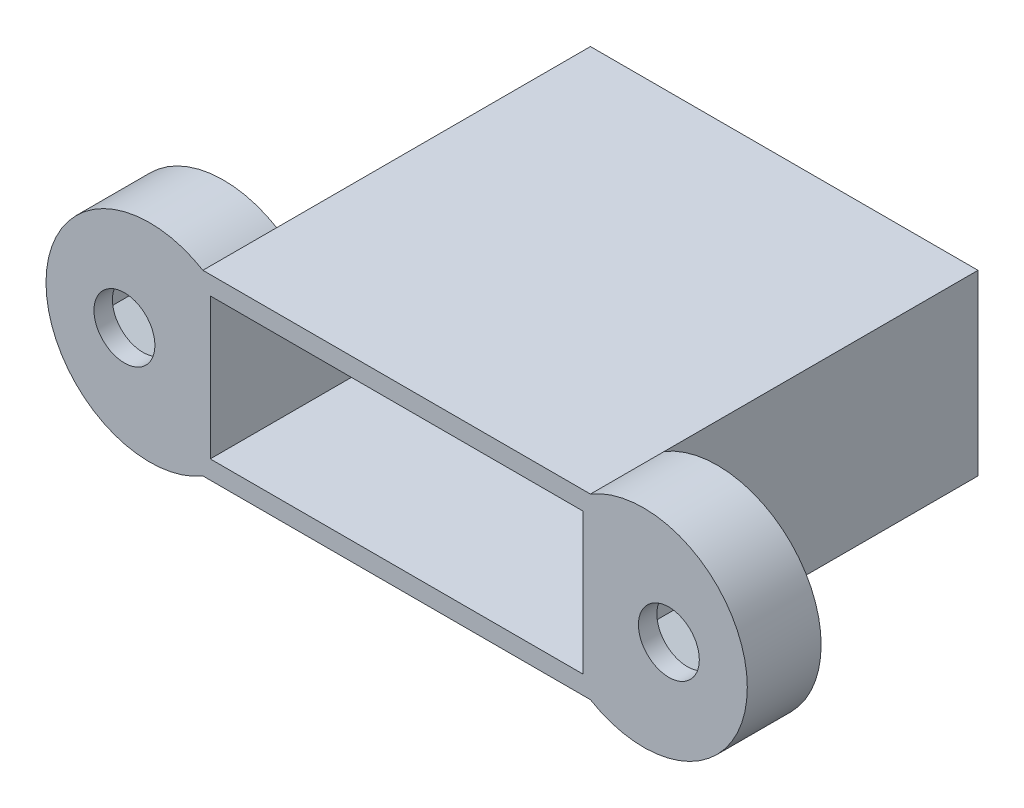
ISO-10303-21;
HEADER;
FILE_DESCRIPTION(('STEP AP214'),'2;1');
FILE_NAME('part.step','',(''),(''),'','','');
FILE_SCHEMA(('AUTOMOTIVE_DESIGN { 1 0 10303 214 1 1 1 1 }'));
ENDSEC;
DATA;
#1=APPLICATION_CONTEXT('core data for automotive mechanical design processes');
#2=APPLICATION_PROTOCOL_DEFINITION('international standard','automotive_design',2000,#1);
#3=PRODUCT_CONTEXT('',#1,'mechanical');
#4=PRODUCT('Part','Part','',(#3));
#5=PRODUCT_RELATED_PRODUCT_CATEGORY('part','',(#4));
#6=PRODUCT_DEFINITION_FORMATION('','',#4);
#7=PRODUCT_DEFINITION_CONTEXT('part definition',#1,'design');
#8=PRODUCT_DEFINITION('design','',#6,#7);
#9=PRODUCT_DEFINITION_SHAPE('','',#8);
#10=(LENGTH_UNIT() NAMED_UNIT(*) SI_UNIT(.MILLI.,.METRE.));
#11=(NAMED_UNIT(*) PLANE_ANGLE_UNIT() SI_UNIT($,.RADIAN.));
#12=(NAMED_UNIT(*) SI_UNIT($,.STERADIAN.) SOLID_ANGLE_UNIT());
#13=UNCERTAINTY_MEASURE_WITH_UNIT(LENGTH_MEASURE(1.E-05),#10,'distance_accuracy_value','');
#14=(GEOMETRIC_REPRESENTATION_CONTEXT(3) GLOBAL_UNCERTAINTY_ASSIGNED_CONTEXT((#13)) GLOBAL_UNIT_ASSIGNED_CONTEXT((#10,
#11,#12)) REPRESENTATION_CONTEXT('',''));
#15=CARTESIAN_POINT('',(0.,0.,0.));
#16=DIRECTION('',(0.,0.,1.));
#17=DIRECTION('',(1.,0.,0.));
#18=AXIS2_PLACEMENT_3D('',#15,#16,#17);
#19=CARTESIAN_POINT('',(-10.0783878504673,4.92646028037383,21.));
#20=DIRECTION('',(1.,0.,0.));
#21=DIRECTION('',(0.,0.,-1.));
#22=AXIS2_PLACEMENT_3D('',#19,#20,#21);
#23=PLANE('',#22);
#24=DIRECTION('',(0.,-1.,0.));
#25=VECTOR('',#24,1.);
#26=CARTESIAN_POINT('',(-10.0783878504673,4.92646028037383,17.));
#27=LINE('',#26,#25);
#28=CARTESIAN_POINT('',(-10.0783878504673,4.92646028037383,17.));
#29=VERTEX_POINT('',#28);
#30=CARTESIAN_POINT('',(-10.0783878504673,-4.72353971962617,17.));
#31=VERTEX_POINT('',#30);
#32=EDGE_CURVE('E368',#29,#31,#27,.T.);
#33=ORIENTED_EDGE('',*,*,#32,.F.);
#34=DIRECTION('',(0.,0.,-1.));
#35=VECTOR('',#34,1.);
#36=CARTESIAN_POINT('',(-10.0783878504673,4.92646028037383,21.));
#37=LINE('',#36,#35);
#38=CARTESIAN_POINT('',(-10.0783878504673,4.92646028037383,0.));
#39=VERTEX_POINT('',#38);
#40=EDGE_CURVE('E456',#29,#39,#37,.T.);
#41=ORIENTED_EDGE('',*,*,#40,.T.);
#42=DIRECTION('',(0.,-1.,0.));
#43=VECTOR('',#42,1.);
#44=CARTESIAN_POINT('',(-10.0783878504673,4.92646028037383,0.));
#45=LINE('',#44,#43);
#46=CARTESIAN_POINT('',(-10.0783878504673,-4.72353971962617,0.));
#47=VERTEX_POINT('',#46);
#48=EDGE_CURVE('E437',#39,#47,#45,.T.);
#49=ORIENTED_EDGE('',*,*,#48,.T.);
#50=DIRECTION('',(0.,0.,-1.));
#51=VECTOR('',#50,1.);
#52=CARTESIAN_POINT('',(-10.0783878504673,-4.72353971962617,21.));
#53=LINE('',#52,#51);
#54=EDGE_CURVE('E483',#31,#47,#53,.T.);
#55=ORIENTED_EDGE('',*,*,#54,.F.);
#56=EDGE_LOOP('',(#33,#41,#49,#55));
#57=FACE_BOUND('',#56,.T.);
#58=ADVANCED_FACE('F39',(#57),#23,.F.);
#59=CARTESIAN_POINT('',(-10.0783878504673,-4.72353971962617,21.));
#60=DIRECTION('',(0.,1.,0.));
#61=DIRECTION('',(0.,0.,1.));
#62=AXIS2_PLACEMENT_3D('',#59,#60,#61);
#63=PLANE('',#62);
#64=DIRECTION('',(1.,0.,0.));
#65=VECTOR('',#64,1.);
#66=CARTESIAN_POINT('',(-10.0783878504673,-4.72353971962617,0.));
#67=LINE('',#66,#65);
#68=CARTESIAN_POINT('',(10.9216121495327,-4.72353971962617,0.));
#69=VERTEX_POINT('',#68);
#70=EDGE_CURVE('E460',#47,#69,#67,.T.);
#71=ORIENTED_EDGE('',*,*,#70,.T.);
#72=DIRECTION('',(0.,0.,-1.));
#73=VECTOR('',#72,1.);
#74=CARTESIAN_POINT('',(10.9216121495327,-4.72353971962617,21.));
#75=LINE('',#74,#73);
#76=CARTESIAN_POINT('',(10.9216121495327,-4.72353971962617,17.));
#77=VERTEX_POINT('',#76);
#78=EDGE_CURVE('E479',#77,#69,#75,.T.);
#79=ORIENTED_EDGE('',*,*,#78,.F.);
#80=CARTESIAN_POINT('',(10.9216121495327,-4.72353971962617,21.));
#81=VERTEX_POINT('',#80);
#82=EDGE_CURVE('E480',#81,#77,#75,.T.);
#83=ORIENTED_EDGE('',*,*,#82,.F.);
#84=DIRECTION('',(1.,0.,0.));
#85=VECTOR('',#84,1.);
#86=CARTESIAN_POINT('',(-10.0783878504673,-4.72353971962617,21.));
#87=LINE('',#86,#85);
#88=CARTESIAN_POINT('',(-10.0783878504673,-4.72353971962617,21.));
#89=VERTEX_POINT('',#88);
#90=EDGE_CURVE('E447',#89,#81,#87,.T.);
#91=ORIENTED_EDGE('',*,*,#90,.F.);
#92=EDGE_CURVE('E484',#89,#31,#53,.T.);
#93=ORIENTED_EDGE('',*,*,#92,.T.);
#94=ORIENTED_EDGE('',*,*,#54,.T.);
#95=EDGE_LOOP('',(#71,#79,#83,#91,#93,#94));
#96=FACE_BOUND('',#95,.T.);
#97=ADVANCED_FACE('F535',(#96),#63,.F.);
#98=CARTESIAN_POINT('',(10.9216121495327,4.92646028037383,21.));
#99=DIRECTION('',(-1.,0.,0.));
#100=DIRECTION('',(0.,-1.,0.));
#101=AXIS2_PLACEMENT_3D('',#98,#99,#100);
#102=PLANE('',#101);
#103=DIRECTION('',(0.,0.,-1.));
#104=VECTOR('',#103,1.);
#105=CARTESIAN_POINT('',(10.9216121495327,4.92646028037383,21.));
#106=LINE('',#105,#104);
#107=CARTESIAN_POINT('',(10.9216121495327,4.92646028037383,17.));
#108=VERTEX_POINT('',#107);
#109=CARTESIAN_POINT('',(10.9216121495327,4.92646028037383,0.));
#110=VERTEX_POINT('',#109);
#111=EDGE_CURVE('E474',#108,#110,#106,.T.);
#112=ORIENTED_EDGE('',*,*,#111,.F.);
#113=DIRECTION('',(0.,-1.,0.));
#114=VECTOR('',#113,1.);
#115=CARTESIAN_POINT('',(10.9216121495327,4.92646028037383,17.));
#116=LINE('',#115,#114);
#117=EDGE_CURVE('E292',#108,#77,#116,.T.);
#118=ORIENTED_EDGE('',*,*,#117,.T.);
#119=ORIENTED_EDGE('',*,*,#78,.T.);
#120=DIRECTION('',(0.,1.,0.));
#121=VECTOR('',#120,1.);
#122=CARTESIAN_POINT('',(10.9216121495327,4.92646028037383,0.));
#123=LINE('',#122,#121);
#124=EDGE_CURVE('E464',#69,#110,#123,.T.);
#125=ORIENTED_EDGE('',*,*,#124,.T.);
#126=EDGE_LOOP('',(#112,#118,#119,#125));
#127=FACE_BOUND('',#126,.T.);
#128=ADVANCED_FACE('F546',(#127),#102,.F.);
#129=CARTESIAN_POINT('',(-10.0783878504673,4.92646028037383,21.));
#130=DIRECTION('',(0.,-1.,0.));
#131=DIRECTION('',(0.,0.,-1.));
#132=AXIS2_PLACEMENT_3D('',#129,#130,#131);
#133=PLANE('',#132);
#134=DIRECTION('',(-1.,0.,0.));
#135=VECTOR('',#134,1.);
#136=CARTESIAN_POINT('',(-10.0783878504673,4.92646028037383,0.));
#137=LINE('',#136,#135);
#138=EDGE_CURVE('E452',#110,#39,#137,.T.);
#139=ORIENTED_EDGE('',*,*,#138,.T.);
#140=ORIENTED_EDGE('',*,*,#40,.F.);
#141=CARTESIAN_POINT('',(-10.0783878504673,4.92646028037383,21.));
#142=VERTEX_POINT('',#141);
#143=EDGE_CURVE('E471',#142,#29,#37,.T.);
#144=ORIENTED_EDGE('',*,*,#143,.F.);
#145=DIRECTION('',(-1.,0.,0.));
#146=VECTOR('',#145,1.);
#147=CARTESIAN_POINT('',(-10.0783878504673,4.92646028037383,21.));
#148=LINE('',#147,#146);
#149=CARTESIAN_POINT('',(10.9216121495327,4.92646028037383,21.));
#150=VERTEX_POINT('',#149);
#151=EDGE_CURVE('E451',#150,#142,#148,.T.);
#152=ORIENTED_EDGE('',*,*,#151,.F.);
#153=EDGE_CURVE('E475',#150,#108,#106,.T.);
#154=ORIENTED_EDGE('',*,*,#153,.T.);
#155=ORIENTED_EDGE('',*,*,#111,.T.);
#156=EDGE_LOOP('',(#139,#140,#144,#152,#154,#155));
#157=FACE_BOUND('',#156,.T.);
#158=ADVANCED_FACE('F509',(#157),#133,.F.);
#159=CARTESIAN_POINT('',(0.,0.,21.));
#160=DIRECTION('',(0.,0.,1.));
#161=DIRECTION('',(1.,0.,0.));
#162=AXIS2_PLACEMENT_3D('',#159,#160,#161);
#163=PLANE('',#162);
#164=CARTESIAN_POINT('',(15.1716121495327,0.101460280373835,21.));
#165=DIRECTION('',(0.,0.,1.));
#166=DIRECTION('',(1.,0.,0.));
#167=AXIS2_PLACEMENT_3D('',#164,#165,#166);
#168=CIRCLE('',#167,1.65);
#169=CARTESIAN_POINT('',(16.8216121495327,0.101460280373835,21.));
#170=VERTEX_POINT('',#169);
#171=EDGE_CURVE('E42',#170,#170,#168,.T.);
#172=ORIENTED_EDGE('',*,*,#171,.F.);
#173=EDGE_LOOP('',(#172));
#174=FACE_BOUND('',#173,.T.);
#175=CARTESIAN_POINT('',(-14.3283878504673,0.101460280373833,21.));
#176=DIRECTION('',(0.,0.,1.));
#177=DIRECTION('',(1.,0.,0.));
#178=AXIS2_PLACEMENT_3D('',#175,#176,#177);
#179=CIRCLE('',#178,1.65);
#180=CARTESIAN_POINT('',(-12.6783878504673,0.101460280373833,21.));
#181=VERTEX_POINT('',#180);
#182=EDGE_CURVE('E302',#181,#181,#179,.T.);
#183=ORIENTED_EDGE('',*,*,#182,.F.);
#184=EDGE_LOOP('',(#183));
#185=FACE_BOUND('',#184,.T.);
#186=DIRECTION('',(0.,-1.,0.));
#187=VECTOR('',#186,1.);
#188=CARTESIAN_POINT('',(-9.67838785046729,3.92646028037383,21.));
#189=LINE('',#188,#187);
#190=CARTESIAN_POINT('',(-9.67838785046729,3.92646028037383,21.));
#191=VERTEX_POINT('',#190);
#192=CARTESIAN_POINT('',(-9.67838785046729,-3.72353971962617,21.));
#193=VERTEX_POINT('',#192);
#194=EDGE_CURVE('E392',#191,#193,#189,.T.);
#195=ORIENTED_EDGE('',*,*,#194,.F.);
#196=DIRECTION('',(-1.,0.,0.));
#197=VECTOR('',#196,1.);
#198=CARTESIAN_POINT('',(-9.67838785046729,3.92646028037383,21.));
#199=LINE('',#198,#197);
#200=CARTESIAN_POINT('',(10.5216121495327,3.92646028037383,21.));
#201=VERTEX_POINT('',#200);
#202=EDGE_CURVE('E407',#201,#191,#199,.T.);
#203=ORIENTED_EDGE('',*,*,#202,.F.);
#204=DIRECTION('',(0.,1.,0.));
#205=VECTOR('',#204,1.);
#206=CARTESIAN_POINT('',(10.5216121495327,3.92646028037383,21.));
#207=LINE('',#206,#205);
#208=CARTESIAN_POINT('',(10.5216121495327,-3.72353971962617,21.));
#209=VERTEX_POINT('',#208);
#210=EDGE_CURVE('E427',#209,#201,#207,.T.);
#211=ORIENTED_EDGE('',*,*,#210,.F.);
#212=DIRECTION('',(1.,0.,0.));
#213=VECTOR('',#212,1.);
#214=CARTESIAN_POINT('',(-9.67838785046729,-3.72353971962617,21.));
#215=LINE('',#214,#213);
#216=EDGE_CURVE('E423',#193,#209,#215,.T.);
#217=ORIENTED_EDGE('',*,*,#216,.F.);
#218=EDGE_LOOP('',(#195,#203,#211,#217));
#219=FACE_BOUND('',#218,.T.);
#220=ORIENTED_EDGE('',*,*,#151,.T.);
#221=CARTESIAN_POINT('',(-12.9589393210555,0.101460280373833,21.));
#222=DIRECTION('',(0.,0.,1.));
#223=DIRECTION('',(1.,0.,0.));
#224=AXIS2_PLACEMENT_3D('',#221,#222,#223);
#225=CIRCLE('',#224,5.61944852941176);
#226=EDGE_CURVE('E353',#142,#89,#225,.T.);
#227=ORIENTED_EDGE('',*,*,#226,.T.);
#228=ORIENTED_EDGE('',*,*,#90,.T.);
#229=CARTESIAN_POINT('',(13.8021636201209,0.101460280373833,21.));
#230=DIRECTION('',(0.,0.,1.));
#231=DIRECTION('',(-1.,0.,0.));
#232=AXIS2_PLACEMENT_3D('',#229,#230,#231);
#233=CIRCLE('',#232,5.61944852941177);
#234=EDGE_CURVE('E277',#81,#150,#233,.T.);
#235=ORIENTED_EDGE('',*,*,#234,.T.);
#236=EDGE_LOOP('',(#220,#227,#228,#235));
#237=FACE_BOUND('',#236,.T.);
#238=ADVANCED_FACE('F505',(#174,#185,#219,#237),#163,.T.);
#239=CARTESIAN_POINT('',(0.,0.,0.));
#240=DIRECTION('',(0.,0.,1.));
#241=DIRECTION('',(1.,0.,0.));
#242=AXIS2_PLACEMENT_3D('',#239,#240,#241);
#243=PLANE('',#242);
#244=DIRECTION('',(-1.,0.,0.));
#245=VECTOR('',#244,1.);
#246=CARTESIAN_POINT('',(0.,3.92646028037383,0.));
#247=LINE('',#246,#245);
#248=CARTESIAN_POINT('',(1.67161214953271,3.92646028037383,0.));
#249=VERTEX_POINT('',#248);
#250=CARTESIAN_POINT('',(-0.828387850467288,3.92646028037383,0.));
#251=VERTEX_POINT('',#250);
#252=EDGE_CURVE('E48',#249,#251,#247,.T.);
#253=ORIENTED_EDGE('',*,*,#252,.T.);
#254=CARTESIAN_POINT('',(-0.828387850467288,1.92646028037383,0.));
#255=DIRECTION('',(0.,0.,1.));
#256=DIRECTION('',(1.,0.,0.));
#257=AXIS2_PLACEMENT_3D('',#254,#255,#256);
#258=CIRCLE('',#257,2.);
#259=CARTESIAN_POINT('',(-0.828387850467288,-0.0735397196261661,0.));
#260=VERTEX_POINT('',#259);
#261=EDGE_CURVE('E11',#251,#260,#258,.T.);
#262=ORIENTED_EDGE('',*,*,#261,.T.);
#263=DIRECTION('',(1.,0.,0.));
#264=VECTOR('',#263,1.);
#265=CARTESIAN_POINT('',(0.,-0.0735397196261661,0.));
#266=LINE('',#265,#264);
#267=CARTESIAN_POINT('',(1.67161214953271,-0.073539719626166,0.));
#268=VERTEX_POINT('',#267);
#269=EDGE_CURVE('E488',#260,#268,#266,.T.);
#270=ORIENTED_EDGE('',*,*,#269,.T.);
#271=CARTESIAN_POINT('',(1.67161214953271,1.92646028037383,0.));
#272=DIRECTION('',(0.,0.,1.));
#273=DIRECTION('',(1.,0.,0.));
#274=AXIS2_PLACEMENT_3D('',#271,#272,#273);
#275=CIRCLE('',#274,2.);
#276=EDGE_CURVE('E492',#268,#249,#275,.T.);
#277=ORIENTED_EDGE('',*,*,#276,.T.);
#278=EDGE_LOOP('',(#253,#262,#270,#277));
#279=FACE_BOUND('',#278,.T.);
#280=ORIENTED_EDGE('',*,*,#48,.F.);
#281=ORIENTED_EDGE('',*,*,#138,.F.);
#282=ORIENTED_EDGE('',*,*,#124,.F.);
#283=ORIENTED_EDGE('',*,*,#70,.F.);
#284=EDGE_LOOP('',(#280,#281,#282,#283));
#285=FACE_BOUND('',#284,.T.);
#286=ADVANCED_FACE('F508',(#279,#285),#243,.F.);
#287=CARTESIAN_POINT('',(-9.67838785046729,3.92646028037383,1.4));
#288=DIRECTION('',(-1.,0.,0.));
#289=DIRECTION('',(0.,-1.,0.));
#290=AXIS2_PLACEMENT_3D('',#287,#288,#289);
#291=PLANE('',#290);
#292=ORIENTED_EDGE('',*,*,#194,.T.);
#293=DIRECTION('',(0.,0.,1.));
#294=VECTOR('',#293,1.);
#295=CARTESIAN_POINT('',(-9.67838785046729,-3.72353971962617,1.4));
#296=LINE('',#295,#294);
#297=CARTESIAN_POINT('',(-9.67838785046729,-3.72353971962617,1.4));
#298=VERTEX_POINT('',#297);
#299=EDGE_CURVE('E420',#298,#193,#296,.T.);
#300=ORIENTED_EDGE('',*,*,#299,.F.);
#301=DIRECTION('',(0.,-1.,0.));
#302=VECTOR('',#301,1.);
#303=CARTESIAN_POINT('',(-9.67838785046729,3.92646028037383,1.4));
#304=LINE('',#303,#302);
#305=CARTESIAN_POINT('',(-9.67838785046729,3.92646028037383,1.4));
#306=VERTEX_POINT('',#305);
#307=EDGE_CURVE('E402',#306,#298,#304,.T.);
#308=ORIENTED_EDGE('',*,*,#307,.F.);
#309=DIRECTION('',(0.,0.,1.));
#310=VECTOR('',#309,1.);
#311=CARTESIAN_POINT('',(-9.67838785046729,3.92646028037383,1.4));
#312=LINE('',#311,#310);
#313=EDGE_CURVE('E434',#306,#191,#312,.T.);
#314=ORIENTED_EDGE('',*,*,#313,.T.);
#315=EDGE_LOOP('',(#292,#300,#308,#314));
#316=FACE_BOUND('',#315,.T.);
#317=ADVANCED_FACE('F564',(#316),#291,.F.);
#318=CARTESIAN_POINT('',(-9.67838785046729,3.92646028037383,1.4));
#319=DIRECTION('',(0.,1.,0.));
#320=DIRECTION('',(-1.,0.,0.));
#321=AXIS2_PLACEMENT_3D('',#318,#319,#320);
#322=PLANE('',#321);
#323=ORIENTED_EDGE('',*,*,#202,.T.);
#324=ORIENTED_EDGE('',*,*,#313,.F.);
#325=DIRECTION('',(-1.,0.,0.));
#326=VECTOR('',#325,1.);
#327=CARTESIAN_POINT('',(-9.67838785046729,3.92646028037383,1.4));
#328=LINE('',#327,#326);
#329=CARTESIAN_POINT('',(-0.828387850467288,3.92646028037383,1.4));
#330=VERTEX_POINT('',#329);
#331=EDGE_CURVE('E415',#330,#306,#328,.T.);
#332=ORIENTED_EDGE('',*,*,#331,.F.);
#333=DIRECTION('',(0.,0.,1.));
#334=VECTOR('',#333,1.);
#335=CARTESIAN_POINT('',(-0.828387850467288,3.92646028037383,-18.2));
#336=LINE('',#335,#334);
#337=EDGE_CURVE('E389',#251,#330,#336,.T.);
#338=ORIENTED_EDGE('',*,*,#337,.F.);
#339=ORIENTED_EDGE('',*,*,#252,.F.);
#340=DIRECTION('',(0.,0.,1.));
#341=VECTOR('',#340,1.);
#342=CARTESIAN_POINT('',(1.67161214953271,3.92646028037383,-18.2));
#343=LINE('',#342,#341);
#344=CARTESIAN_POINT('',(1.67161214953271,3.92646028037383,1.4));
#345=VERTEX_POINT('',#344);
#346=EDGE_CURVE('E393',#249,#345,#343,.T.);
#347=ORIENTED_EDGE('',*,*,#346,.T.);
#348=CARTESIAN_POINT('',(10.5216121495327,3.92646028037383,1.4));
#349=VERTEX_POINT('',#348);
#350=EDGE_CURVE('E416',#349,#345,#328,.T.);
#351=ORIENTED_EDGE('',*,*,#350,.F.);
#352=DIRECTION('',(0.,0.,1.));
#353=VECTOR('',#352,1.);
#354=CARTESIAN_POINT('',(10.5216121495327,3.92646028037383,1.4));
#355=LINE('',#354,#353);
#356=EDGE_CURVE('E438',#349,#201,#355,.T.);
#357=ORIENTED_EDGE('',*,*,#356,.T.);
#358=EDGE_LOOP('',(#323,#324,#332,#338,#339,#347,#351,#357));
#359=FACE_BOUND('',#358,.T.);
#360=ADVANCED_FACE('F562',(#359),#322,.F.);
#361=CARTESIAN_POINT('',(10.5216121495327,3.92646028037383,1.4));
#362=DIRECTION('',(1.,0.,0.));
#363=DIRECTION('',(0.,1.,0.));
#364=AXIS2_PLACEMENT_3D('',#361,#362,#363);
#365=PLANE('',#364);
#366=ORIENTED_EDGE('',*,*,#210,.T.);
#367=ORIENTED_EDGE('',*,*,#356,.F.);
#368=DIRECTION('',(0.,1.,0.));
#369=VECTOR('',#368,1.);
#370=CARTESIAN_POINT('',(10.5216121495327,3.92646028037383,1.4));
#371=LINE('',#370,#369);
#372=CARTESIAN_POINT('',(10.5216121495327,-3.72353971962617,1.4));
#373=VERTEX_POINT('',#372);
#374=EDGE_CURVE('E411',#373,#349,#371,.T.);
#375=ORIENTED_EDGE('',*,*,#374,.F.);
#376=DIRECTION('',(0.,0.,1.));
#377=VECTOR('',#376,1.);
#378=CARTESIAN_POINT('',(10.5216121495327,-3.72353971962617,1.4));
#379=LINE('',#378,#377);
#380=EDGE_CURVE('E441',#373,#209,#379,.T.);
#381=ORIENTED_EDGE('',*,*,#380,.T.);
#382=EDGE_LOOP('',(#366,#367,#375,#381));
#383=FACE_BOUND('',#382,.T.);
#384=ADVANCED_FACE('F710',(#383),#365,.F.);
#385=CARTESIAN_POINT('',(-9.67838785046729,-3.72353971962617,1.4));
#386=DIRECTION('',(0.,-1.,0.));
#387=DIRECTION('',(0.,0.,-1.));
#388=AXIS2_PLACEMENT_3D('',#385,#386,#387);
#389=PLANE('',#388);
#390=ORIENTED_EDGE('',*,*,#216,.T.);
#391=ORIENTED_EDGE('',*,*,#380,.F.);
#392=DIRECTION('',(1.,0.,0.));
#393=VECTOR('',#392,1.);
#394=CARTESIAN_POINT('',(-9.67838785046729,-3.72353971962617,1.4));
#395=LINE('',#394,#393);
#396=EDGE_CURVE('E406',#298,#373,#395,.T.);
#397=ORIENTED_EDGE('',*,*,#396,.F.);
#398=ORIENTED_EDGE('',*,*,#299,.T.);
#399=EDGE_LOOP('',(#390,#391,#397,#398));
#400=FACE_BOUND('',#399,.T.);
#401=ADVANCED_FACE('F567',(#400),#389,.F.);
#402=CARTESIAN_POINT('',(0.,0.,1.4));
#403=DIRECTION('',(0.,0.,1.));
#404=DIRECTION('',(1.,0.,0.));
#405=AXIS2_PLACEMENT_3D('',#402,#403,#404);
#406=PLANE('',#405);
#407=CARTESIAN_POINT('',(-0.828387850467288,1.92646028037383,1.4));
#408=DIRECTION('',(0.,0.,1.));
#409=DIRECTION('',(1.,0.,0.));
#410=AXIS2_PLACEMENT_3D('',#407,#408,#409);
#411=CIRCLE('',#410,2.);
#412=CARTESIAN_POINT('',(-0.828387850467288,-0.0735397196261661,1.4));
#413=VERTEX_POINT('',#412);
#414=EDGE_CURVE('E375',#330,#413,#411,.T.);
#415=ORIENTED_EDGE('',*,*,#414,.F.);
#416=ORIENTED_EDGE('',*,*,#331,.T.);
#417=ORIENTED_EDGE('',*,*,#307,.T.);
#418=ORIENTED_EDGE('',*,*,#396,.T.);
#419=ORIENTED_EDGE('',*,*,#374,.T.);
#420=ORIENTED_EDGE('',*,*,#350,.T.);
#421=CARTESIAN_POINT('',(1.67161214953271,1.92646028037383,1.4));
#422=DIRECTION('',(0.,0.,1.));
#423=DIRECTION('',(1.,0.,0.));
#424=AXIS2_PLACEMENT_3D('',#421,#422,#423);
#425=CIRCLE('',#424,2.);
#426=CARTESIAN_POINT('',(1.67161214953271,-0.073539719626166,1.4));
#427=VERTEX_POINT('',#426);
#428=EDGE_CURVE('E384',#427,#345,#425,.T.);
#429=ORIENTED_EDGE('',*,*,#428,.F.);
#430=DIRECTION('',(1.,0.,0.));
#431=VECTOR('',#430,1.);
#432=CARTESIAN_POINT('',(-0.828387850467288,-0.0735397196261661,1.4));
#433=LINE('',#432,#431);
#434=EDGE_CURVE('E381',#413,#427,#433,.T.);
#435=ORIENTED_EDGE('',*,*,#434,.F.);
#436=EDGE_LOOP('',(#415,#416,#417,#418,#419,#420,#429,#435));
#437=FACE_BOUND('',#436,.T.);
#438=ADVANCED_FACE('F557',(#437),#406,.T.);
#439=CARTESIAN_POINT('',(-0.828387850467288,1.92646028037383,-18.2));
#440=DIRECTION('',(0.,0.,1.));
#441=DIRECTION('',(1.,0.,0.));
#442=AXIS2_PLACEMENT_3D('',#439,#440,#441);
#443=CYLINDRICAL_SURFACE('',#442,2.);
#444=ORIENTED_EDGE('',*,*,#337,.T.);
#445=ORIENTED_EDGE('',*,*,#414,.T.);
#446=DIRECTION('',(0.,0.,1.));
#447=VECTOR('',#446,1.);
#448=CARTESIAN_POINT('',(-0.828387850467288,-0.0735397196261661,-18.2));
#449=LINE('',#448,#447);
#450=EDGE_CURVE('E388',#260,#413,#449,.T.);
#451=ORIENTED_EDGE('',*,*,#450,.F.);
#452=ORIENTED_EDGE('',*,*,#261,.F.);
#453=EDGE_LOOP('',(#444,#445,#451,#452));
#454=FACE_BOUND('',#453,.T.);
#455=ADVANCED_FACE('F580',(#454),#443,.F.);
#456=CARTESIAN_POINT('',(1.67161214953271,1.92646028037383,-18.2));
#457=DIRECTION('',(0.,0.,1.));
#458=DIRECTION('',(1.,0.,0.));
#459=AXIS2_PLACEMENT_3D('',#456,#457,#458);
#460=CYLINDRICAL_SURFACE('',#459,2.);
#461=DIRECTION('',(0.,0.,1.));
#462=VECTOR('',#461,1.);
#463=CARTESIAN_POINT('',(1.67161214953271,-0.073539719626166,-18.2));
#464=LINE('',#463,#462);
#465=EDGE_CURVE('E396',#268,#427,#464,.T.);
#466=ORIENTED_EDGE('',*,*,#465,.T.);
#467=ORIENTED_EDGE('',*,*,#428,.T.);
#468=ORIENTED_EDGE('',*,*,#346,.F.);
#469=ORIENTED_EDGE('',*,*,#276,.F.);
#470=EDGE_LOOP('',(#466,#467,#468,#469));
#471=FACE_BOUND('',#470,.T.);
#472=ADVANCED_FACE('F575',(#471),#460,.F.);
#473=CARTESIAN_POINT('',(-0.828387850467288,-0.0735397196261661,-18.2));
#474=DIRECTION('',(0.,-1.,0.));
#475=DIRECTION('',(1.,0.,0.));
#476=AXIS2_PLACEMENT_3D('',#473,#474,#475);
#477=PLANE('',#476);
#478=ORIENTED_EDGE('',*,*,#450,.T.);
#479=ORIENTED_EDGE('',*,*,#434,.T.);
#480=ORIENTED_EDGE('',*,*,#465,.F.);
#481=ORIENTED_EDGE('',*,*,#269,.F.);
#482=EDGE_LOOP('',(#478,#479,#480,#481));
#483=FACE_BOUND('',#482,.T.);
#484=ADVANCED_FACE('F577',(#483),#477,.F.);
#485=CARTESIAN_POINT('',(-12.9589393210555,0.101460280373833,17.));
#486=DIRECTION('',(0.,0.,1.));
#487=DIRECTION('',(1.,0.,0.));
#488=AXIS2_PLACEMENT_3D('',#485,#486,#487);
#489=CYLINDRICAL_SURFACE('',#488,5.61944852941176);
#490=ORIENTED_EDGE('',*,*,#226,.F.);
#491=ORIENTED_EDGE('',*,*,#143,.T.);
#492=CARTESIAN_POINT('',(-12.9589393210555,0.101460280373833,17.));
#493=DIRECTION('',(0.,0.,1.));
#494=DIRECTION('',(1.,0.,0.));
#495=AXIS2_PLACEMENT_3D('',#492,#493,#494);
#496=CIRCLE('',#495,5.61944852941176);
#497=EDGE_CURVE('E371',#29,#31,#496,.T.);
#498=ORIENTED_EDGE('',*,*,#497,.T.);
#499=ORIENTED_EDGE('',*,*,#92,.F.);
#500=EDGE_LOOP('',(#490,#491,#498,#499));
#501=FACE_BOUND('',#500,.T.);
#502=ADVANCED_FACE('F524',(#501),#489,.T.);
#503=CARTESIAN_POINT('',(-12.9589393210555,0.101460280373833,17.));
#504=DIRECTION('',(0.,0.,1.));
#505=DIRECTION('',(1.,0.,0.));
#506=AXIS2_PLACEMENT_3D('',#503,#504,#505);
#507=PLANE('',#506);
#508=DIRECTION('',(0.866025403784439,-0.5,0.));
#509=VECTOR('',#508,1.);
#510=CARTESIAN_POINT('',(-14.3283878504673,3.85146028037383,17.));
#511=LINE('',#510,#509);
#512=CARTESIAN_POINT('',(-14.3283878504673,3.85146028037383,17.));
#513=VERTEX_POINT('',#512);
#514=CARTESIAN_POINT('',(-11.0807925862756,1.97646028037383,17.));
#515=VERTEX_POINT('',#514);
#516=EDGE_CURVE('E331',#513,#515,#511,.T.);
#517=ORIENTED_EDGE('',*,*,#516,.F.);
#518=DIRECTION('',(0.866025403784439,0.5,0.));
#519=VECTOR('',#518,1.);
#520=CARTESIAN_POINT('',(-17.5759831146589,1.97646028037383,17.));
#521=LINE('',#520,#519);
#522=CARTESIAN_POINT('',(-17.5759831146589,1.97646028037383,17.));
#523=VERTEX_POINT('',#522);
#524=EDGE_CURVE('E64',#523,#513,#521,.T.);
#525=ORIENTED_EDGE('',*,*,#524,.F.);
#526=DIRECTION('',(0.,1.,0.));
#527=VECTOR('',#526,1.);
#528=CARTESIAN_POINT('',(-17.5759831146589,-1.77353971962617,17.));
#529=LINE('',#528,#527);
#530=CARTESIAN_POINT('',(-17.5759831146589,-1.77353971962617,17.));
#531=VERTEX_POINT('',#530);
#532=EDGE_CURVE('E308',#531,#523,#529,.T.);
#533=ORIENTED_EDGE('',*,*,#532,.F.);
#534=DIRECTION('',(-0.866025403784439,0.5,0.));
#535=VECTOR('',#534,1.);
#536=CARTESIAN_POINT('',(-14.3283878504673,-3.64853971962617,17.));
#537=LINE('',#536,#535);
#538=CARTESIAN_POINT('',(-14.3283878504673,-3.64853971962617,17.));
#539=VERTEX_POINT('',#538);
#540=EDGE_CURVE('E343',#539,#531,#537,.T.);
#541=ORIENTED_EDGE('',*,*,#540,.F.);
#542=DIRECTION('',(-0.866025403784439,-0.5,0.));
#543=VECTOR('',#542,1.);
#544=CARTESIAN_POINT('',(-11.0807925862756,-1.77353971962617,17.));
#545=LINE('',#544,#543);
#546=CARTESIAN_POINT('',(-11.0807925862756,-1.77353971962617,17.));
#547=VERTEX_POINT('',#546);
#548=EDGE_CURVE('E339',#547,#539,#545,.T.);
#549=ORIENTED_EDGE('',*,*,#548,.F.);
#550=DIRECTION('',(0.,-1.,0.));
#551=VECTOR('',#550,1.);
#552=CARTESIAN_POINT('',(-11.0807925862756,1.97646028037383,17.));
#553=LINE('',#552,#551);
#554=EDGE_CURVE('E335',#515,#547,#553,.T.);
#555=ORIENTED_EDGE('',*,*,#554,.F.);
#556=EDGE_LOOP('',(#517,#525,#533,#541,#549,#555));
#557=FACE_BOUND('',#556,.T.);
#558=ORIENTED_EDGE('',*,*,#32,.T.);
#559=ORIENTED_EDGE('',*,*,#497,.F.);
#560=EDGE_LOOP('',(#558,#559));
#561=FACE_BOUND('',#560,.T.);
#562=ADVANCED_FACE('F528',(#557,#561),#507,.F.);
#563=CARTESIAN_POINT('',(-17.5759831146589,1.97646028037383,20.));
#564=DIRECTION('',(-0.5,0.866025403784439,0.));
#565=DIRECTION('',(-0.866025403784439,-0.5,0.));
#566=AXIS2_PLACEMENT_3D('',#563,#564,#565);
#567=PLANE('',#566);
#568=ORIENTED_EDGE('',*,*,#524,.T.);
#569=DIRECTION('',(0.,0.,-1.));
#570=VECTOR('',#569,1.);
#571=CARTESIAN_POINT('',(-14.3283878504673,3.85146028037383,20.));
#572=LINE('',#571,#570);
#573=CARTESIAN_POINT('',(-14.3283878504673,3.85146028037383,20.));
#574=VERTEX_POINT('',#573);
#575=EDGE_CURVE('E328',#574,#513,#572,.T.);
#576=ORIENTED_EDGE('',*,*,#575,.F.);
#577=DIRECTION('',(0.866025403784439,0.5,0.));
#578=VECTOR('',#577,1.);
#579=CARTESIAN_POINT('',(-17.5759831146589,1.97646028037383,20.));
#580=LINE('',#579,#578);
#581=CARTESIAN_POINT('',(-17.5759831146589,1.97646028037383,20.));
#582=VERTEX_POINT('',#581);
#583=EDGE_CURVE('E303',#582,#574,#580,.T.);
#584=ORIENTED_EDGE('',*,*,#583,.F.);
#585=DIRECTION('',(0.,0.,-1.));
#586=VECTOR('',#585,1.);
#587=CARTESIAN_POINT('',(-17.5759831146589,1.97646028037383,20.));
#588=LINE('',#587,#586);
#589=EDGE_CURVE('E350',#582,#523,#588,.T.);
#590=ORIENTED_EDGE('',*,*,#589,.T.);
#591=EDGE_LOOP('',(#568,#576,#584,#590));
#592=FACE_BOUND('',#591,.T.);
#593=ADVANCED_FACE('F677',(#592),#567,.F.);
#594=CARTESIAN_POINT('',(-17.5759831146589,-1.77353971962617,20.));
#595=DIRECTION('',(-1.,0.,0.));
#596=DIRECTION('',(0.,0.,1.));
#597=AXIS2_PLACEMENT_3D('',#594,#595,#596);
#598=PLANE('',#597);
#599=ORIENTED_EDGE('',*,*,#532,.T.);
#600=ORIENTED_EDGE('',*,*,#589,.F.);
#601=DIRECTION('',(0.,1.,0.));
#602=VECTOR('',#601,1.);
#603=CARTESIAN_POINT('',(-17.5759831146589,-1.77353971962617,20.));
#604=LINE('',#603,#602);
#605=CARTESIAN_POINT('',(-17.5759831146589,-1.77353971962617,20.));
#606=VERTEX_POINT('',#605);
#607=EDGE_CURVE('E324',#606,#582,#604,.T.);
#608=ORIENTED_EDGE('',*,*,#607,.F.);
#609=DIRECTION('',(0.,0.,-1.));
#610=VECTOR('',#609,1.);
#611=CARTESIAN_POINT('',(-17.5759831146589,-1.77353971962617,20.));
#612=LINE('',#611,#610);
#613=EDGE_CURVE('E354',#606,#531,#612,.T.);
#614=ORIENTED_EDGE('',*,*,#613,.T.);
#615=EDGE_LOOP('',(#599,#600,#608,#614));
#616=FACE_BOUND('',#615,.T.);
#617=ADVANCED_FACE('F673',(#616),#598,.F.);
#618=CARTESIAN_POINT('',(-14.3283878504673,-3.64853971962617,20.));
#619=DIRECTION('',(-0.5,-0.866025403784439,0.));
#620=DIRECTION('',(0.866025403784439,-0.5,0.));
#621=AXIS2_PLACEMENT_3D('',#618,#619,#620);
#622=PLANE('',#621);
#623=ORIENTED_EDGE('',*,*,#540,.T.);
#624=ORIENTED_EDGE('',*,*,#613,.F.);
#625=DIRECTION('',(-0.866025403784439,0.5,0.));
#626=VECTOR('',#625,1.);
#627=CARTESIAN_POINT('',(-14.3283878504673,-3.64853971962617,20.));
#628=LINE('',#627,#626);
#629=CARTESIAN_POINT('',(-14.3283878504673,-3.64853971962617,20.));
#630=VERTEX_POINT('',#629);
#631=EDGE_CURVE('E320',#630,#606,#628,.T.);
#632=ORIENTED_EDGE('',*,*,#631,.F.);
#633=DIRECTION('',(0.,0.,-1.));
#634=VECTOR('',#633,1.);
#635=CARTESIAN_POINT('',(-14.3283878504673,-3.64853971962617,20.));
#636=LINE('',#635,#634);
#637=EDGE_CURVE('E357',#630,#539,#636,.T.);
#638=ORIENTED_EDGE('',*,*,#637,.T.);
#639=EDGE_LOOP('',(#623,#624,#632,#638));
#640=FACE_BOUND('',#639,.T.);
#641=ADVANCED_FACE('F676',(#640),#622,.F.);
#642=CARTESIAN_POINT('',(-11.0807925862756,-1.77353971962617,20.));
#643=DIRECTION('',(0.5,-0.866025403784439,0.));
#644=DIRECTION('',(0.866025403784439,0.5,0.));
#645=AXIS2_PLACEMENT_3D('',#642,#643,#644);
#646=PLANE('',#645);
#647=ORIENTED_EDGE('',*,*,#548,.T.);
#648=ORIENTED_EDGE('',*,*,#637,.F.);
#649=DIRECTION('',(-0.866025403784439,-0.5,0.));
#650=VECTOR('',#649,1.);
#651=CARTESIAN_POINT('',(-11.0807925862756,-1.77353971962617,20.));
#652=LINE('',#651,#650);
#653=CARTESIAN_POINT('',(-11.0807925862756,-1.77353971962617,20.));
#654=VERTEX_POINT('',#653);
#655=EDGE_CURVE('E316',#654,#630,#652,.T.);
#656=ORIENTED_EDGE('',*,*,#655,.F.);
#657=DIRECTION('',(0.,0.,-1.));
#658=VECTOR('',#657,1.);
#659=CARTESIAN_POINT('',(-11.0807925862756,-1.77353971962617,20.));
#660=LINE('',#659,#658);
#661=EDGE_CURVE('E360',#654,#547,#660,.T.);
#662=ORIENTED_EDGE('',*,*,#661,.T.);
#663=EDGE_LOOP('',(#647,#648,#656,#662));
#664=FACE_BOUND('',#663,.T.);
#665=ADVANCED_FACE('F681',(#664),#646,.F.);
#666=CARTESIAN_POINT('',(-11.0807925862756,1.97646028037383,20.));
#667=DIRECTION('',(1.,0.,0.));
#668=DIRECTION('',(0.,0.,-1.));
#669=AXIS2_PLACEMENT_3D('',#666,#667,#668);
#670=PLANE('',#669);
#671=ORIENTED_EDGE('',*,*,#554,.T.);
#672=ORIENTED_EDGE('',*,*,#661,.F.);
#673=DIRECTION('',(0.,-1.,0.));
#674=VECTOR('',#673,1.);
#675=CARTESIAN_POINT('',(-11.0807925862756,1.97646028037383,20.));
#676=LINE('',#675,#674);
#677=CARTESIAN_POINT('',(-11.0807925862756,1.97646028037383,20.));
#678=VERTEX_POINT('',#677);
#679=EDGE_CURVE('E312',#678,#654,#676,.T.);
#680=ORIENTED_EDGE('',*,*,#679,.F.);
#681=DIRECTION('',(0.,0.,-1.));
#682=VECTOR('',#681,1.);
#683=CARTESIAN_POINT('',(-11.0807925862756,1.97646028037383,20.));
#684=LINE('',#683,#682);
#685=EDGE_CURVE('E363',#678,#515,#684,.T.);
#686=ORIENTED_EDGE('',*,*,#685,.T.);
#687=EDGE_LOOP('',(#671,#672,#680,#686));
#688=FACE_BOUND('',#687,.T.);
#689=ADVANCED_FACE('F685',(#688),#670,.F.);
#690=CARTESIAN_POINT('',(-14.3283878504673,3.85146028037383,20.));
#691=DIRECTION('',(0.5,0.866025403784439,0.));
#692=DIRECTION('',(-0.866025403784439,0.5,0.));
#693=AXIS2_PLACEMENT_3D('',#690,#691,#692);
#694=PLANE('',#693);
#695=ORIENTED_EDGE('',*,*,#516,.T.);
#696=ORIENTED_EDGE('',*,*,#685,.F.);
#697=DIRECTION('',(0.866025403784439,-0.5,0.));
#698=VECTOR('',#697,1.);
#699=CARTESIAN_POINT('',(-14.3283878504673,3.85146028037383,20.));
#700=LINE('',#699,#698);
#701=EDGE_CURVE('E307',#574,#678,#700,.T.);
#702=ORIENTED_EDGE('',*,*,#701,.F.);
#703=ORIENTED_EDGE('',*,*,#575,.T.);
#704=EDGE_LOOP('',(#695,#696,#702,#703));
#705=FACE_BOUND('',#704,.T.);
#706=ADVANCED_FACE('F671',(#705),#694,.F.);
#707=CARTESIAN_POINT('',(0.,0.,20.));
#708=DIRECTION('',(0.,0.,-1.));
#709=DIRECTION('',(-1.,0.,0.));
#710=AXIS2_PLACEMENT_3D('',#707,#708,#709);
#711=PLANE('',#710);
#712=CARTESIAN_POINT('',(-14.3283878504673,0.101460280373833,20.));
#713=DIRECTION('',(0.,0.,-1.));
#714=DIRECTION('',(-1.,0.,0.));
#715=AXIS2_PLACEMENT_3D('',#712,#713,#714);
#716=CIRCLE('',#715,1.65);
#717=CARTESIAN_POINT('',(-15.9783878504673,0.101460280373833,20.));
#718=VERTEX_POINT('',#717);
#719=EDGE_CURVE('E296',#718,#718,#716,.T.);
#720=ORIENTED_EDGE('',*,*,#719,.F.);
#721=EDGE_LOOP('',(#720));
#722=FACE_BOUND('',#721,.T.);
#723=ORIENTED_EDGE('',*,*,#583,.T.);
#724=ORIENTED_EDGE('',*,*,#701,.T.);
#725=ORIENTED_EDGE('',*,*,#679,.T.);
#726=ORIENTED_EDGE('',*,*,#655,.T.);
#727=ORIENTED_EDGE('',*,*,#631,.T.);
#728=ORIENTED_EDGE('',*,*,#607,.T.);
#729=EDGE_LOOP('',(#723,#724,#725,#726,#727,#728));
#730=FACE_BOUND('',#729,.T.);
#731=ADVANCED_FACE('F668',(#722,#730),#711,.T.);
#732=CARTESIAN_POINT('',(-14.3283878504673,0.101460280373833,23.));
#733=DIRECTION('',(0.,0.,-1.));
#734=DIRECTION('',(-1.,0.,0.));
#735=AXIS2_PLACEMENT_3D('',#732,#733,#734);
#736=CYLINDRICAL_SURFACE('',#735,1.65);
#737=ORIENTED_EDGE('',*,*,#182,.T.);
#738=EDGE_LOOP('',(#737));
#739=FACE_BOUND('',#738,.T.);
#740=ORIENTED_EDGE('',*,*,#719,.T.);
#741=EDGE_LOOP('',(#740));
#742=FACE_BOUND('',#741,.T.);
#743=ADVANCED_FACE('F502',(#739,#742),#736,.F.);
#744=CARTESIAN_POINT('',(13.8021636201209,0.101460280373833,17.));
#745=DIRECTION('',(0.,0.,1.));
#746=DIRECTION('',(1.,0.,0.));
#747=AXIS2_PLACEMENT_3D('',#744,#745,#746);
#748=CYLINDRICAL_SURFACE('',#747,5.61944852941177);
#749=ORIENTED_EDGE('',*,*,#234,.F.);
#750=ORIENTED_EDGE('',*,*,#82,.T.);
#751=CARTESIAN_POINT('',(13.8021636201209,0.101460280373833,17.));
#752=DIRECTION('',(0.,0.,1.));
#753=DIRECTION('',(-1.,0.,0.));
#754=AXIS2_PLACEMENT_3D('',#751,#752,#753);
#755=CIRCLE('',#754,5.61944852941177);
#756=EDGE_CURVE('E289',#77,#108,#755,.T.);
#757=ORIENTED_EDGE('',*,*,#756,.T.);
#758=ORIENTED_EDGE('',*,*,#153,.F.);
#759=EDGE_LOOP('',(#749,#750,#757,#758));
#760=FACE_BOUND('',#759,.T.);
#761=ADVANCED_FACE('F540',(#760),#748,.T.);
#762=CARTESIAN_POINT('',(13.8021636201209,0.101460280373833,17.));
#763=DIRECTION('',(0.,0.,-1.));
#764=DIRECTION('',(-1.,0.,0.));
#765=AXIS2_PLACEMENT_3D('',#762,#763,#764);
#766=PLANE('',#765);
#767=DIRECTION('',(0.866025403784438,0.5,0.));
#768=VECTOR('',#767,1.);
#769=CARTESIAN_POINT('',(11.9240168853411,1.97646028037384,17.));
#770=LINE('',#769,#768);
#771=CARTESIAN_POINT('',(11.9240168853411,1.97646028037384,17.));
#772=VERTEX_POINT('',#771);
#773=CARTESIAN_POINT('',(15.1716121495327,3.85146028037384,17.));
#774=VERTEX_POINT('',#773);
#775=EDGE_CURVE('E56',#772,#774,#770,.T.);
#776=ORIENTED_EDGE('',*,*,#775,.F.);
#777=DIRECTION('',(0.,1.,0.));
#778=VECTOR('',#777,1.);
#779=CARTESIAN_POINT('',(11.9240168853411,-1.77353971962617,17.));
#780=LINE('',#779,#778);
#781=CARTESIAN_POINT('',(11.9240168853411,-1.77353971962617,17.));
#782=VERTEX_POINT('',#781);
#783=EDGE_CURVE('E238',#782,#772,#780,.T.);
#784=ORIENTED_EDGE('',*,*,#783,.F.);
#785=DIRECTION('',(-0.866025403784439,0.5,0.));
#786=VECTOR('',#785,1.);
#787=CARTESIAN_POINT('',(15.1716121495327,-3.64853971962616,17.));
#788=LINE('',#787,#786);
#789=CARTESIAN_POINT('',(15.1716121495327,-3.64853971962616,17.));
#790=VERTEX_POINT('',#789);
#791=EDGE_CURVE('E242',#790,#782,#788,.T.);
#792=ORIENTED_EDGE('',*,*,#791,.F.);
#793=DIRECTION('',(-0.866025403784439,-0.5,0.));
#794=VECTOR('',#793,1.);
#795=CARTESIAN_POINT('',(18.4192074137244,-1.77353971962617,17.));
#796=LINE('',#795,#794);
#797=CARTESIAN_POINT('',(18.4192074137244,-1.77353971962617,17.));
#798=VERTEX_POINT('',#797);
#799=EDGE_CURVE('E267',#798,#790,#796,.T.);
#800=ORIENTED_EDGE('',*,*,#799,.F.);
#801=DIRECTION('',(0.,-1.,0.));
#802=VECTOR('',#801,1.);
#803=CARTESIAN_POINT('',(18.4192074137244,1.97646028037384,17.));
#804=LINE('',#803,#802);
#805=CARTESIAN_POINT('',(18.4192074137244,1.97646028037384,17.));
#806=VERTEX_POINT('',#805);
#807=EDGE_CURVE('E263',#806,#798,#804,.T.);
#808=ORIENTED_EDGE('',*,*,#807,.F.);
#809=DIRECTION('',(0.866025403784439,-0.5,0.));
#810=VECTOR('',#809,1.);
#811=CARTESIAN_POINT('',(15.1716121495327,3.85146028037384,17.));
#812=LINE('',#811,#810);
#813=EDGE_CURVE('E260',#774,#806,#812,.T.);
#814=ORIENTED_EDGE('',*,*,#813,.F.);
#815=EDGE_LOOP('',(#776,#784,#792,#800,#808,#814));
#816=FACE_BOUND('',#815,.T.);
#817=ORIENTED_EDGE('',*,*,#756,.F.);
#818=ORIENTED_EDGE('',*,*,#117,.F.);
#819=EDGE_LOOP('',(#817,#818));
#820=FACE_BOUND('',#819,.T.);
#821=ADVANCED_FACE('F543',(#816,#820),#766,.T.);
#822=CARTESIAN_POINT('',(11.9240168853411,1.97646028037384,20.));
#823=DIRECTION('',(-0.5,0.866025403784439,0.));
#824=DIRECTION('',(-0.866025403784439,-0.5,0.));
#825=AXIS2_PLACEMENT_3D('',#822,#823,#824);
#826=PLANE('',#825);
#827=ORIENTED_EDGE('',*,*,#775,.T.);
#828=DIRECTION('',(0.,0.,-1.));
#829=VECTOR('',#828,1.);
#830=CARTESIAN_POINT('',(15.1716121495327,3.85146028037384,20.));
#831=LINE('',#830,#829);
#832=CARTESIAN_POINT('',(15.1716121495327,3.85146028037384,20.));
#833=VERTEX_POINT('',#832);
#834=EDGE_CURVE('E212',#833,#774,#831,.T.);
#835=ORIENTED_EDGE('',*,*,#834,.F.);
#836=DIRECTION('',(0.866025403784438,0.5,0.));
#837=VECTOR('',#836,1.);
#838=CARTESIAN_POINT('',(11.9240168853411,1.97646028037384,20.));
#839=LINE('',#838,#837);
#840=CARTESIAN_POINT('',(11.9240168853411,1.97646028037384,20.));
#841=VERTEX_POINT('',#840);
#842=EDGE_CURVE('E216',#841,#833,#839,.T.);
#843=ORIENTED_EDGE('',*,*,#842,.F.);
#844=DIRECTION('',(0.,0.,-1.));
#845=VECTOR('',#844,1.);
#846=CARTESIAN_POINT('',(11.9240168853411,1.97646028037384,20.));
#847=LINE('',#846,#845);
#848=EDGE_CURVE('E274',#841,#772,#847,.T.);
#849=ORIENTED_EDGE('',*,*,#848,.T.);
#850=EDGE_LOOP('',(#827,#835,#843,#849));
#851=FACE_BOUND('',#850,.T.);
#852=ADVANCED_FACE('F214',(#851),#826,.F.);
#853=CARTESIAN_POINT('',(11.9240168853411,-1.77353971962617,20.));
#854=DIRECTION('',(-1.,0.,0.));
#855=DIRECTION('',(0.,-1.,0.));
#856=AXIS2_PLACEMENT_3D('',#853,#854,#855);
#857=PLANE('',#856);
#858=ORIENTED_EDGE('',*,*,#783,.T.);
#859=ORIENTED_EDGE('',*,*,#848,.F.);
#860=DIRECTION('',(0.,1.,0.));
#861=VECTOR('',#860,1.);
#862=CARTESIAN_POINT('',(11.9240168853411,-1.77353971962617,20.));
#863=LINE('',#862,#861);
#864=CARTESIAN_POINT('',(11.9240168853411,-1.77353971962617,20.));
#865=VERTEX_POINT('',#864);
#866=EDGE_CURVE('E223',#865,#841,#863,.T.);
#867=ORIENTED_EDGE('',*,*,#866,.F.);
#868=DIRECTION('',(0.,0.,-1.));
#869=VECTOR('',#868,1.);
#870=CARTESIAN_POINT('',(11.9240168853411,-1.77353971962617,20.));
#871=LINE('',#870,#869);
#872=EDGE_CURVE('E278',#865,#782,#871,.T.);
#873=ORIENTED_EDGE('',*,*,#872,.T.);
#874=EDGE_LOOP('',(#858,#859,#867,#873));
#875=FACE_BOUND('',#874,.T.);
#876=ADVANCED_FACE('F642',(#875),#857,.F.);
#877=CARTESIAN_POINT('',(15.1716121495327,-3.64853971962616,20.));
#878=DIRECTION('',(-0.5,-0.866025403784439,0.));
#879=DIRECTION('',(0.866025403784439,-0.5,0.));
#880=AXIS2_PLACEMENT_3D('',#877,#878,#879);
#881=PLANE('',#880);
#882=ORIENTED_EDGE('',*,*,#791,.T.);
#883=ORIENTED_EDGE('',*,*,#872,.F.);
#884=DIRECTION('',(-0.866025403784439,0.5,0.));
#885=VECTOR('',#884,1.);
#886=CARTESIAN_POINT('',(15.1716121495327,-3.64853971962616,20.));
#887=LINE('',#886,#885);
#888=CARTESIAN_POINT('',(15.1716121495327,-3.64853971962616,20.));
#889=VERTEX_POINT('',#888);
#890=EDGE_CURVE('E253',#889,#865,#887,.T.);
#891=ORIENTED_EDGE('',*,*,#890,.F.);
#892=DIRECTION('',(0.,0.,-1.));
#893=VECTOR('',#892,1.);
#894=CARTESIAN_POINT('',(15.1716121495327,-3.64853971962616,20.));
#895=LINE('',#894,#893);
#896=EDGE_CURVE('E281',#889,#790,#895,.T.);
#897=ORIENTED_EDGE('',*,*,#896,.T.);
#898=EDGE_LOOP('',(#882,#883,#891,#897));
#899=FACE_BOUND('',#898,.T.);
#900=ADVANCED_FACE('F645',(#899),#881,.F.);
#901=CARTESIAN_POINT('',(18.4192074137244,-1.77353971962617,20.));
#902=DIRECTION('',(0.5,-0.866025403784438,0.));
#903=DIRECTION('',(0.866025403784439,0.5,0.));
#904=AXIS2_PLACEMENT_3D('',#901,#902,#903);
#905=PLANE('',#904);
#906=ORIENTED_EDGE('',*,*,#799,.T.);
#907=ORIENTED_EDGE('',*,*,#896,.F.);
#908=DIRECTION('',(-0.866025403784439,-0.5,0.));
#909=VECTOR('',#908,1.);
#910=CARTESIAN_POINT('',(18.4192074137244,-1.77353971962617,20.));
#911=LINE('',#910,#909);
#912=CARTESIAN_POINT('',(18.4192074137244,-1.77353971962617,20.));
#913=VERTEX_POINT('',#912);
#914=EDGE_CURVE('E249',#913,#889,#911,.T.);
#915=ORIENTED_EDGE('',*,*,#914,.F.);
#916=DIRECTION('',(0.,0.,-1.));
#917=VECTOR('',#916,1.);
#918=CARTESIAN_POINT('',(18.4192074137244,-1.77353971962617,20.));
#919=LINE('',#918,#917);
#920=EDGE_CURVE('E284',#913,#798,#919,.T.);
#921=ORIENTED_EDGE('',*,*,#920,.T.);
#922=EDGE_LOOP('',(#906,#907,#915,#921));
#923=FACE_BOUND('',#922,.T.);
#924=ADVANCED_FACE('F649',(#923),#905,.F.);
#925=CARTESIAN_POINT('',(18.4192074137244,1.97646028037384,20.));
#926=DIRECTION('',(1.,0.,0.));
#927=DIRECTION('',(0.,0.,-1.));
#928=AXIS2_PLACEMENT_3D('',#925,#926,#927);
#929=PLANE('',#928);
#930=ORIENTED_EDGE('',*,*,#807,.T.);
#931=ORIENTED_EDGE('',*,*,#920,.F.);
#932=DIRECTION('',(0.,-1.,0.));
#933=VECTOR('',#932,1.);
#934=CARTESIAN_POINT('',(18.4192074137244,1.97646028037384,20.));
#935=LINE('',#934,#933);
#936=CARTESIAN_POINT('',(18.4192074137244,1.97646028037384,20.));
#937=VERTEX_POINT('',#936);
#938=EDGE_CURVE('E232',#937,#913,#935,.T.);
#939=ORIENTED_EDGE('',*,*,#938,.F.);
#940=DIRECTION('',(0.,0.,-1.));
#941=VECTOR('',#940,1.);
#942=CARTESIAN_POINT('',(18.4192074137244,1.97646028037384,20.));
#943=LINE('',#942,#941);
#944=EDGE_CURVE('E222',#937,#806,#943,.T.);
#945=ORIENTED_EDGE('',*,*,#944,.T.);
#946=EDGE_LOOP('',(#930,#931,#939,#945));
#947=FACE_BOUND('',#946,.T.);
#948=ADVANCED_FACE('F653',(#947),#929,.F.);
#949=CARTESIAN_POINT('',(15.1716121495327,3.85146028037384,20.));
#950=DIRECTION('',(0.5,0.866025403784439,0.));
#951=DIRECTION('',(-0.866025403784439,0.5,0.));
#952=AXIS2_PLACEMENT_3D('',#949,#950,#951);
#953=PLANE('',#952);
#954=ORIENTED_EDGE('',*,*,#813,.T.);
#955=ORIENTED_EDGE('',*,*,#944,.F.);
#956=DIRECTION('',(0.866025403784439,-0.5,0.));
#957=VECTOR('',#956,1.);
#958=CARTESIAN_POINT('',(15.1716121495327,3.85146028037384,20.));
#959=LINE('',#958,#957);
#960=EDGE_CURVE('E226',#833,#937,#959,.T.);
#961=ORIENTED_EDGE('',*,*,#960,.F.);
#962=ORIENTED_EDGE('',*,*,#834,.T.);
#963=EDGE_LOOP('',(#954,#955,#961,#962));
#964=FACE_BOUND('',#963,.T.);
#965=ADVANCED_FACE('F227',(#964),#953,.F.);
#966=CARTESIAN_POINT('',(0.,0.,20.));
#967=DIRECTION('',(0.,0.,-1.));
#968=DIRECTION('',(-1.,0.,0.));
#969=AXIS2_PLACEMENT_3D('',#966,#967,#968);
#970=PLANE('',#969);
#971=CARTESIAN_POINT('',(15.1716121495327,0.101460280373835,20.));
#972=DIRECTION('',(0.,0.,-1.));
#973=DIRECTION('',(-1.,0.,0.));
#974=AXIS2_PLACEMENT_3D('',#971,#972,#973);
#975=CIRCLE('',#974,1.65);
#976=CARTESIAN_POINT('',(13.5216121495327,0.101460280373835,20.));
#977=VERTEX_POINT('',#976);
#978=EDGE_CURVE('E245',#977,#977,#975,.T.);
#979=ORIENTED_EDGE('',*,*,#978,.F.);
#980=EDGE_LOOP('',(#979));
#981=FACE_BOUND('',#980,.T.);
#982=ORIENTED_EDGE('',*,*,#842,.T.);
#983=ORIENTED_EDGE('',*,*,#960,.T.);
#984=ORIENTED_EDGE('',*,*,#938,.T.);
#985=ORIENTED_EDGE('',*,*,#914,.T.);
#986=ORIENTED_EDGE('',*,*,#890,.T.);
#987=ORIENTED_EDGE('',*,*,#866,.T.);
#988=EDGE_LOOP('',(#982,#983,#984,#985,#986,#987));
#989=FACE_BOUND('',#988,.T.);
#990=ADVANCED_FACE('F234',(#981,#989),#970,.T.);
#991=CARTESIAN_POINT('',(15.1716121495327,0.101460280373835,23.));
#992=DIRECTION('',(0.,0.,-1.));
#993=DIRECTION('',(-1.,0.,0.));
#994=AXIS2_PLACEMENT_3D('',#991,#992,#993);
#995=CYLINDRICAL_SURFACE('',#994,1.65);
#996=ORIENTED_EDGE('',*,*,#171,.T.);
#997=EDGE_LOOP('',(#996));
#998=FACE_BOUND('',#997,.T.);
#999=ORIENTED_EDGE('',*,*,#978,.T.);
#1000=EDGE_LOOP('',(#999));
#1001=FACE_BOUND('',#1000,.T.);
#1002=ADVANCED_FACE('F625',(#998,#1001),#995,.F.);
#1003=CLOSED_SHELL('',(#58,#97,#128,#158,#238,#286,#317,#360,#384,#401,#438,#455,#472,#484,#502,
#562,#593,#617,#641,#665,#689,#706,#731,#743,#761,#821,#852,#876,#900,#924,#948,#965,#990,#1002));
#1004=MANIFOLD_SOLID_BREP('B2',#1003);
#1005=ADVANCED_BREP_SHAPE_REPRESENTATION('',(#18,#1004),#14);
#1006=SHAPE_DEFINITION_REPRESENTATION(#9,#1005);
ENDSEC;
END-ISO-10303-21;
